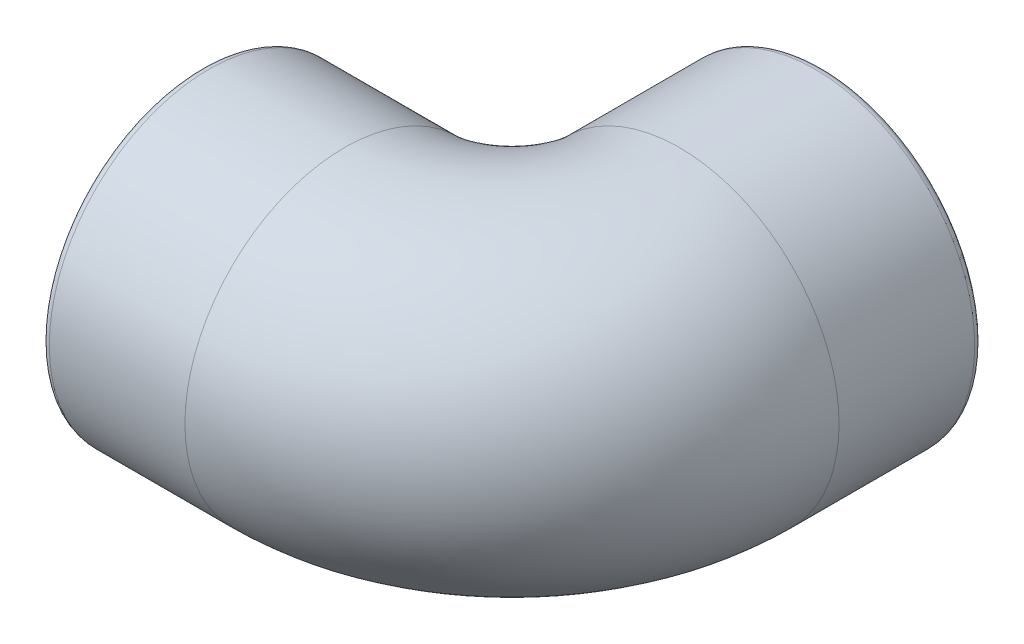
ISO-10303-21;
HEADER;
FILE_DESCRIPTION(('STEP AP214'),'2;1');
FILE_NAME('part.step','',(''),(''),'','','');
FILE_SCHEMA(('AUTOMOTIVE_DESIGN { 1 0 10303 214 1 1 1 1 }'));
ENDSEC;
DATA;
#1=APPLICATION_CONTEXT('core data for automotive mechanical design processes');
#2=APPLICATION_PROTOCOL_DEFINITION('international standard','automotive_design',2000,#1);
#3=PRODUCT_CONTEXT('',#1,'mechanical');
#4=PRODUCT('Part','Part','',(#3));
#5=PRODUCT_RELATED_PRODUCT_CATEGORY('part','',(#4));
#6=PRODUCT_DEFINITION_FORMATION('','',#4);
#7=PRODUCT_DEFINITION_CONTEXT('part definition',#1,'design');
#8=PRODUCT_DEFINITION('design','',#6,#7);
#9=PRODUCT_DEFINITION_SHAPE('','',#8);
#10=(LENGTH_UNIT() NAMED_UNIT(*) SI_UNIT(.MILLI.,.METRE.));
#11=(NAMED_UNIT(*) PLANE_ANGLE_UNIT() SI_UNIT($,.RADIAN.));
#12=(NAMED_UNIT(*) SI_UNIT($,.STERADIAN.) SOLID_ANGLE_UNIT());
#13=UNCERTAINTY_MEASURE_WITH_UNIT(LENGTH_MEASURE(1.E-05),#10,'distance_accuracy_value','');
#14=(GEOMETRIC_REPRESENTATION_CONTEXT(3) GLOBAL_UNCERTAINTY_ASSIGNED_CONTEXT((#13)) GLOBAL_UNIT_ASSIGNED_CONTEXT((#10,
#11,#12)) REPRESENTATION_CONTEXT('',''));
#15=CARTESIAN_POINT('',(0.,0.,0.));
#16=DIRECTION('',(0.,0.,1.));
#17=DIRECTION('',(1.,0.,0.));
#18=AXIS2_PLACEMENT_3D('',#15,#16,#17);
#19=CARTESIAN_POINT('',(0.,0.,0.));
#20=DIRECTION('',(0.,-1.,0.));
#21=DIRECTION('',(0.,0.,-1.));
#22=AXIS2_PLACEMENT_3D('',#19,#20,#21);
#23=TOROIDAL_SURFACE('',#22,21.,20.);
#24=CARTESIAN_POINT('',(21.,0.,0.));
#25=DIRECTION('',(0.,0.,-1.));
#26=DIRECTION('',(-1.,0.,0.));
#27=AXIS2_PLACEMENT_3D('',#24,#25,#26);
#28=CIRCLE('',#27,20.);
#29=CARTESIAN_POINT('',(41.,0.,-1.43150817805485E-13));
#30=VERTEX_POINT('',#29);
#31=EDGE_CURVE('E52',#30,#30,#28,.T.);
#32=CARTESIAN_POINT('',(0.,0.,21.));
#33=DIRECTION('',(-1.,0.,0.));
#34=DIRECTION('',(0.,0.,1.));
#35=AXIS2_PLACEMENT_3D('',#32,#33,#34);
#36=CIRCLE('',#35,20.);
#37=CARTESIAN_POINT('',(0.,0.,41.));
#38=VERTEX_POINT('',#37);
#39=EDGE_CURVE('E58',#38,#38,#36,.T.);
#40=CARTESIAN_POINT('',(0.,0.,0.));
#41=DIRECTION('',(0.,-1.,0.));
#42=DIRECTION('',(0.,0.,-1.));
#43=AXIS2_PLACEMENT_3D('',#40,#41,#42);
#44=CIRCLE('',#43,41.);
#45=EDGE_CURVE('',#30,#38,#44,.T.);
#46=ORIENTED_EDGE('',*,*,#31,.F.);
#47=ORIENTED_EDGE('',*,*,#39,.F.);
#48=ORIENTED_EDGE('',*,*,#45,.T.);
#49=ORIENTED_EDGE('',*,*,#45,.F.);
#50=EDGE_LOOP('',(#46,#48,#47,#49));
#51=FACE_BOUND('',#50,.T.);
#52=ADVANCED_FACE('F32',(#51),#23,.T.);
#53=CARTESIAN_POINT('',(0.,0.,0.));
#54=DIRECTION('',(0.,-1.,0.));
#55=DIRECTION('',(0.,0.,-1.));
#56=AXIS2_PLACEMENT_3D('',#53,#54,#55);
#57=TOROIDAL_SURFACE('',#56,21.,17.);
#58=CARTESIAN_POINT('',(21.,0.,0.));
#59=DIRECTION('',(0.,0.,-1.));
#60=DIRECTION('',(-1.,0.,0.));
#61=AXIS2_PLACEMENT_3D('',#58,#59,#60);
#62=CIRCLE('',#61,17.);
#63=CARTESIAN_POINT('',(38.,0.,-1.32676367722157E-13));
#64=VERTEX_POINT('',#63);
#65=EDGE_CURVE('E65',#64,#64,#62,.T.);
#66=CARTESIAN_POINT('',(0.,0.,21.));
#67=DIRECTION('',(1.,0.,0.));
#68=DIRECTION('',(0.,0.,-1.));
#69=AXIS2_PLACEMENT_3D('',#66,#67,#68);
#70=CIRCLE('',#69,17.);
#71=CARTESIAN_POINT('',(0.,0.,38.));
#72=VERTEX_POINT('',#71);
#73=EDGE_CURVE('E55',#72,#72,#70,.T.);
#74=CARTESIAN_POINT('',(0.,0.,0.));
#75=DIRECTION('',(0.,-1.,0.));
#76=DIRECTION('',(0.,0.,-1.));
#77=AXIS2_PLACEMENT_3D('',#74,#75,#76);
#78=CIRCLE('',#77,38.);
#79=EDGE_CURVE('',#64,#72,#78,.T.);
#80=ORIENTED_EDGE('',*,*,#65,.T.);
#81=ORIENTED_EDGE('',*,*,#73,.F.);
#82=ORIENTED_EDGE('',*,*,#79,.T.);
#83=ORIENTED_EDGE('',*,*,#79,.F.);
#84=EDGE_LOOP('',(#80,#82,#81,#83));
#85=FACE_BOUND('',#84,.T.);
#86=ADVANCED_FACE('F91',(#85),#57,.F.);
#87=CARTESIAN_POINT('',(-18.,0.,21.));
#88=DIRECTION('',(-1.,0.,0.));
#89=DIRECTION('',(0.,0.,1.));
#90=AXIS2_PLACEMENT_3D('',#87,#88,#89);
#91=PLANE('',#90);
#92=CARTESIAN_POINT('',(-18.,0.,21.));
#93=DIRECTION('',(-1.,0.,0.));
#94=DIRECTION('',(0.,0.,1.));
#95=AXIS2_PLACEMENT_3D('',#92,#93,#94);
#96=CIRCLE('',#95,19.);
#97=CARTESIAN_POINT('',(-18.,0.,40.));
#98=VERTEX_POINT('',#97);
#99=EDGE_CURVE('E39',#98,#98,#96,.T.);
#100=ORIENTED_EDGE('',*,*,#99,.T.);
#101=EDGE_LOOP('',(#100));
#102=FACE_BOUND('',#101,.T.);
#103=CARTESIAN_POINT('',(-18.,0.,21.));
#104=DIRECTION('',(-1.,0.,0.));
#105=DIRECTION('',(0.,0.,1.));
#106=AXIS2_PLACEMENT_3D('',#103,#104,#105);
#107=CIRCLE('',#106,17.);
#108=CARTESIAN_POINT('',(-18.,0.,38.));
#109=VERTEX_POINT('',#108);
#110=EDGE_CURVE('E61',#109,#109,#107,.T.);
#111=ORIENTED_EDGE('',*,*,#110,.F.);
#112=EDGE_LOOP('',(#111));
#113=FACE_BOUND('',#112,.T.);
#114=ADVANCED_FACE('F97',(#102,#113),#91,.T.);
#115=CARTESIAN_POINT('',(-18.,0.,21.));
#116=DIRECTION('',(1.,0.,0.));
#117=DIRECTION('',(0.,0.,-1.));
#118=AXIS2_PLACEMENT_3D('',#115,#116,#117);
#119=CYLINDRICAL_SURFACE('',#118,20.);
#120=CARTESIAN_POINT('',(-17.,0.,21.));
#121=DIRECTION('',(-1.,0.,0.));
#122=DIRECTION('',(0.,0.,1.));
#123=AXIS2_PLACEMENT_3D('',#120,#121,#122);
#124=CIRCLE('',#123,20.);
#125=CARTESIAN_POINT('',(-17.,0.,41.));
#126=VERTEX_POINT('',#125);
#127=EDGE_CURVE('E10',#126,#126,#124,.F.);
#128=ORIENTED_EDGE('',*,*,#127,.T.);
#129=EDGE_LOOP('',(#128));
#130=FACE_BOUND('',#129,.T.);
#131=ORIENTED_EDGE('',*,*,#39,.T.);
#132=EDGE_LOOP('',(#131));
#133=FACE_BOUND('',#132,.T.);
#134=ADVANCED_FACE('F86',(#130,#133),#119,.T.);
#135=CARTESIAN_POINT('',(-18.,0.,21.));
#136=DIRECTION('',(1.,0.,0.));
#137=DIRECTION('',(0.,0.,-1.));
#138=AXIS2_PLACEMENT_3D('',#135,#136,#137);
#139=CYLINDRICAL_SURFACE('',#138,17.);
#140=ORIENTED_EDGE('',*,*,#110,.T.);
#141=EDGE_LOOP('',(#140));
#142=FACE_BOUND('',#141,.T.);
#143=ORIENTED_EDGE('',*,*,#73,.T.);
#144=EDGE_LOOP('',(#143));
#145=FACE_BOUND('',#144,.T.);
#146=ADVANCED_FACE('F77',(#142,#145),#139,.F.);
#147=CARTESIAN_POINT('',(20.9999999999999,0.,-18.0000000000001));
#148=DIRECTION('',(0.,0.,-1.));
#149=DIRECTION('',(-1.,0.,0.));
#150=AXIS2_PLACEMENT_3D('',#147,#148,#149);
#151=PLANE('',#150);
#152=CARTESIAN_POINT('',(20.9999999999999,0.,-18.0000000000001));
#153=DIRECTION('',(0.,0.,-1.));
#154=DIRECTION('',(-1.,0.,0.));
#155=AXIS2_PLACEMENT_3D('',#152,#153,#154);
#156=CIRCLE('',#155,19.);
#157=CARTESIAN_POINT('',(1.99999999999994,0.,-18.));
#158=VERTEX_POINT('',#157);
#159=EDGE_CURVE('E47',#158,#158,#156,.T.);
#160=ORIENTED_EDGE('',*,*,#159,.T.);
#161=EDGE_LOOP('',(#160));
#162=FACE_BOUND('',#161,.T.);
#163=CARTESIAN_POINT('',(20.9999999999999,0.,-18.0000000000001));
#164=DIRECTION('',(0.,0.,-1.));
#165=DIRECTION('',(-1.,0.,0.));
#166=AXIS2_PLACEMENT_3D('',#163,#164,#165);
#167=CIRCLE('',#166,17.);
#168=CARTESIAN_POINT('',(3.99999999999994,0.,-18.));
#169=VERTEX_POINT('',#168);
#170=EDGE_CURVE('E64',#169,#169,#167,.T.);
#171=ORIENTED_EDGE('',*,*,#170,.F.);
#172=EDGE_LOOP('',(#171));
#173=FACE_BOUND('',#172,.T.);
#174=ADVANCED_FACE('F74',(#162,#173),#151,.T.);
#175=CARTESIAN_POINT('',(20.9999999999999,0.,-18.0000000000001));
#176=DIRECTION('',(0.,0.,1.));
#177=DIRECTION('',(1.,0.,0.));
#178=AXIS2_PLACEMENT_3D('',#175,#176,#177);
#179=CYLINDRICAL_SURFACE('',#178,20.);
#180=CARTESIAN_POINT('',(20.9999999999999,0.,-17.0000000000001));
#181=DIRECTION('',(0.,0.,-1.));
#182=DIRECTION('',(-1.,0.,0.));
#183=AXIS2_PLACEMENT_3D('',#180,#181,#182);
#184=CIRCLE('',#183,20.);
#185=CARTESIAN_POINT('',(0.999999999999942,0.,-17.));
#186=VERTEX_POINT('',#185);
#187=EDGE_CURVE('E43',#186,#186,#184,.F.);
#188=ORIENTED_EDGE('',*,*,#187,.T.);
#189=EDGE_LOOP('',(#188));
#190=FACE_BOUND('',#189,.T.);
#191=ORIENTED_EDGE('',*,*,#31,.T.);
#192=EDGE_LOOP('',(#191));
#193=FACE_BOUND('',#192,.T.);
#194=ADVANCED_FACE('F76',(#190,#193),#179,.T.);
#195=CARTESIAN_POINT('',(20.9999999999999,0.,-18.0000000000001));
#196=DIRECTION('',(0.,0.,1.));
#197=DIRECTION('',(1.,0.,0.));
#198=AXIS2_PLACEMENT_3D('',#195,#196,#197);
#199=CYLINDRICAL_SURFACE('',#198,17.);
#200=ORIENTED_EDGE('',*,*,#170,.T.);
#201=EDGE_LOOP('',(#200));
#202=FACE_BOUND('',#201,.T.);
#203=ORIENTED_EDGE('',*,*,#65,.F.);
#204=EDGE_LOOP('',(#203));
#205=FACE_BOUND('',#204,.T.);
#206=ADVANCED_FACE('F71',(#202,#205),#199,.F.);
#207=CARTESIAN_POINT('',(20.9999999999999,0.,-17.0000000000001));
#208=DIRECTION('',(0.,0.,-1.));
#209=DIRECTION('',(-1.,0.,0.));
#210=AXIS2_PLACEMENT_3D('',#207,#208,#209);
#211=TOROIDAL_SURFACE('',#210,19.,1.);
#212=ORIENTED_EDGE('',*,*,#187,.F.);
#213=EDGE_LOOP('',(#212));
#214=FACE_BOUND('',#213,.T.);
#215=ORIENTED_EDGE('',*,*,#159,.F.);
#216=EDGE_LOOP('',(#215));
#217=FACE_BOUND('',#216,.T.);
#218=ADVANCED_FACE('F103',(#214,#217),#211,.T.);
#219=CARTESIAN_POINT('',(-17.,0.,21.));
#220=DIRECTION('',(-1.,0.,0.));
#221=DIRECTION('',(0.,0.,1.));
#222=AXIS2_PLACEMENT_3D('',#219,#220,#221);
#223=TOROIDAL_SURFACE('',#222,19.,1.);
#224=ORIENTED_EDGE('',*,*,#127,.F.);
#225=EDGE_LOOP('',(#224));
#226=FACE_BOUND('',#225,.T.);
#227=ORIENTED_EDGE('',*,*,#99,.F.);
#228=EDGE_LOOP('',(#227));
#229=FACE_BOUND('',#228,.T.);
#230=ADVANCED_FACE('F34',(#226,#229),#223,.T.);
#231=CLOSED_SHELL('',(#52,#86,#114,#134,#146,#174,#194,#206,#218,#230));
#232=MANIFOLD_SOLID_BREP('B2',#231);
#233=ADVANCED_BREP_SHAPE_REPRESENTATION('',(#18,#232),#14);
#234=SHAPE_DEFINITION_REPRESENTATION(#9,#233);
ENDSEC;
END-ISO-10303-21;
